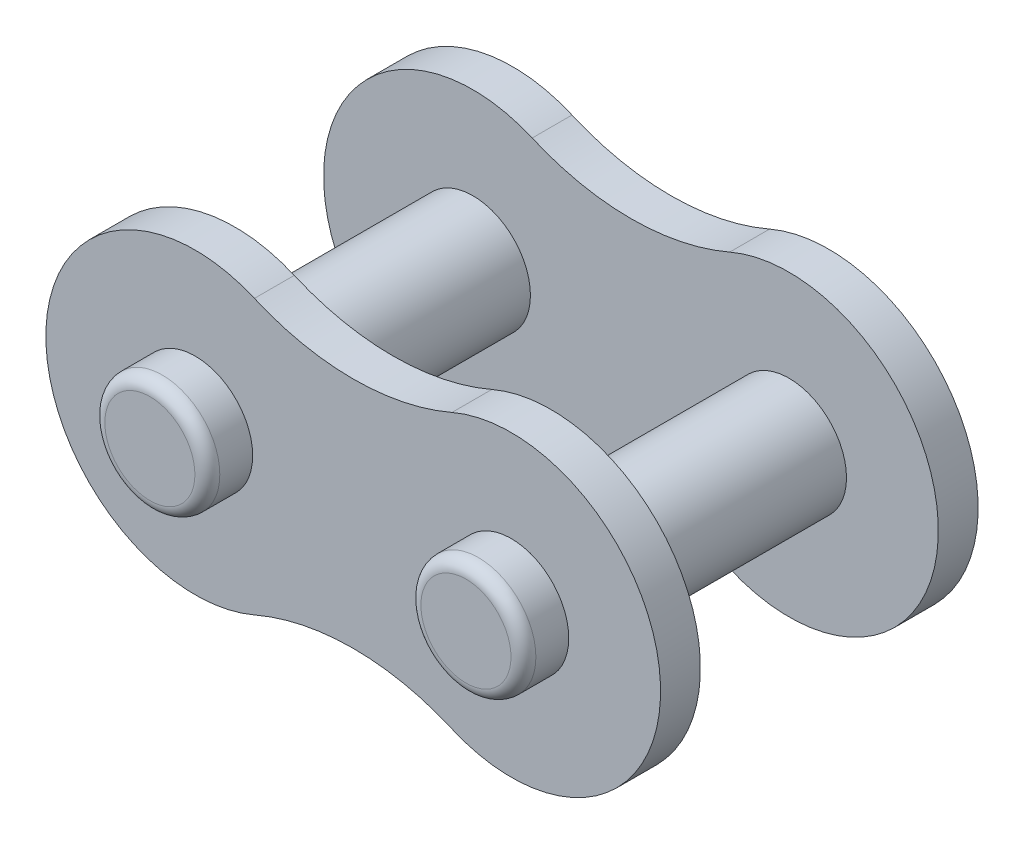
ISO-10303-21;
HEADER;
FILE_DESCRIPTION(('STEP AP214'),'2;1');
FILE_NAME('part.step','',(''),(''),'','','');
FILE_SCHEMA(('AUTOMOTIVE_DESIGN { 1 0 10303 214 1 1 1 1 }'));
ENDSEC;
DATA;
#1=APPLICATION_CONTEXT('core data for automotive mechanical design processes');
#2=APPLICATION_PROTOCOL_DEFINITION('international standard','automotive_design',2000,#1);
#3=PRODUCT_CONTEXT('',#1,'mechanical');
#4=PRODUCT('Part','Part','',(#3));
#5=PRODUCT_RELATED_PRODUCT_CATEGORY('part','',(#4));
#6=PRODUCT_DEFINITION_FORMATION('','',#4);
#7=PRODUCT_DEFINITION_CONTEXT('part definition',#1,'design');
#8=PRODUCT_DEFINITION('design','',#6,#7);
#9=PRODUCT_DEFINITION_SHAPE('','',#8);
#10=(LENGTH_UNIT() NAMED_UNIT(*) SI_UNIT(.MILLI.,.METRE.));
#11=(NAMED_UNIT(*) PLANE_ANGLE_UNIT() SI_UNIT($,.RADIAN.));
#12=(NAMED_UNIT(*) SI_UNIT($,.STERADIAN.) SOLID_ANGLE_UNIT());
#13=UNCERTAINTY_MEASURE_WITH_UNIT(LENGTH_MEASURE(1.E-05),#10,'distance_accuracy_value','');
#14=(GEOMETRIC_REPRESENTATION_CONTEXT(3) GLOBAL_UNCERTAINTY_ASSIGNED_CONTEXT((#13)) GLOBAL_UNIT_ASSIGNED_CONTEXT((#10,
#11,#12)) REPRESENTATION_CONTEXT('',''));
#15=CARTESIAN_POINT('',(0.,0.,0.));
#16=DIRECTION('',(0.,0.,1.));
#17=DIRECTION('',(1.,0.,0.));
#18=AXIS2_PLACEMENT_3D('',#15,#16,#17);
#19=CARTESIAN_POINT('',(3.175,7.34298134275173,0.8));
#20=DIRECTION('',(0.,0.,-1.));
#21=DIRECTION('',(-1.,0.,0.));
#22=AXIS2_PLACEMENT_3D('',#19,#20,#21);
#23=CYLINDRICAL_SURFACE('',#22,5.);
#24=CARTESIAN_POINT('',(3.175,7.34298134275173,0.));
#25=DIRECTION('',(0.,0.,-1.));
#26=DIRECTION('',(1.,0.,0.));
#27=AXIS2_PLACEMENT_3D('',#24,#25,#26);
#28=CIRCLE('',#27,5.);
#29=CARTESIAN_POINT('',(5.159375,2.7536180035319,0.));
#30=VERTEX_POINT('',#29);
#31=CARTESIAN_POINT('',(1.190625,2.7536180035319,0.));
#32=VERTEX_POINT('',#31);
#33=EDGE_CURVE('E151',#30,#32,#28,.T.);
#34=ORIENTED_EDGE('',*,*,#33,.T.);
#35=DIRECTION('',(0.,0.,-1.));
#36=VECTOR('',#35,1.);
#37=CARTESIAN_POINT('',(1.190625,2.7536180035319,0.8));
#38=LINE('',#37,#36);
#39=CARTESIAN_POINT('',(1.190625,2.7536180035319,0.8));
#40=VERTEX_POINT('',#39);
#41=EDGE_CURVE('E172',#40,#32,#38,.T.);
#42=ORIENTED_EDGE('',*,*,#41,.F.);
#43=CARTESIAN_POINT('',(3.175,7.34298134275173,0.8));
#44=DIRECTION('',(0.,0.,-1.));
#45=DIRECTION('',(1.,0.,0.));
#46=AXIS2_PLACEMENT_3D('',#43,#44,#45);
#47=CIRCLE('',#46,5.);
#48=CARTESIAN_POINT('',(5.159375,2.7536180035319,0.8));
#49=VERTEX_POINT('',#48);
#50=EDGE_CURVE('E154',#49,#40,#47,.T.);
#51=ORIENTED_EDGE('',*,*,#50,.F.);
#52=DIRECTION('',(0.,0.,-1.));
#53=VECTOR('',#52,1.);
#54=CARTESIAN_POINT('',(5.159375,2.7536180035319,0.8));
#55=LINE('',#54,#53);
#56=EDGE_CURVE('E160',#49,#30,#55,.T.);
#57=ORIENTED_EDGE('',*,*,#56,.T.);
#58=EDGE_LOOP('',(#34,#42,#51,#57));
#59=FACE_BOUND('',#58,.T.);
#60=ADVANCED_FACE('F35',(#59),#23,.F.);
#61=CARTESIAN_POINT('',(0.,0.,0.8));
#62=DIRECTION('',(0.,0.,-1.));
#63=DIRECTION('',(-1.,0.,0.));
#64=AXIS2_PLACEMENT_3D('',#61,#62,#63);
#65=CYLINDRICAL_SURFACE('',#64,3.);
#66=CARTESIAN_POINT('',(0.,0.,0.));
#67=DIRECTION('',(0.,0.,1.));
#68=DIRECTION('',(1.,0.,0.));
#69=AXIS2_PLACEMENT_3D('',#66,#67,#68);
#70=CIRCLE('',#69,3.);
#71=CARTESIAN_POINT('',(1.190625,-2.7536180035319,0.));
#72=VERTEX_POINT('',#71);
#73=EDGE_CURVE('E163',#32,#72,#70,.T.);
#74=ORIENTED_EDGE('',*,*,#73,.T.);
#75=DIRECTION('',(0.,0.,-1.));
#76=VECTOR('',#75,1.);
#77=CARTESIAN_POINT('',(1.190625,-2.7536180035319,0.8));
#78=LINE('',#77,#76);
#79=CARTESIAN_POINT('',(1.190625,-2.7536180035319,0.8));
#80=VERTEX_POINT('',#79);
#81=EDGE_CURVE('E170',#80,#72,#78,.T.);
#82=ORIENTED_EDGE('',*,*,#81,.F.);
#83=CARTESIAN_POINT('',(0.,0.,0.8));
#84=DIRECTION('',(0.,0.,1.));
#85=DIRECTION('',(1.,0.,0.));
#86=AXIS2_PLACEMENT_3D('',#83,#84,#85);
#87=CIRCLE('',#86,3.);
#88=EDGE_CURVE('E84',#40,#80,#87,.T.);
#89=ORIENTED_EDGE('',*,*,#88,.F.);
#90=ORIENTED_EDGE('',*,*,#41,.T.);
#91=EDGE_LOOP('',(#74,#82,#89,#90));
#92=FACE_BOUND('',#91,.T.);
#93=ADVANCED_FACE('F212',(#92),#65,.T.);
#94=CARTESIAN_POINT('',(3.175,-7.34298134275173,0.8));
#95=DIRECTION('',(0.,0.,-1.));
#96=DIRECTION('',(-1.,0.,0.));
#97=AXIS2_PLACEMENT_3D('',#94,#95,#96);
#98=CYLINDRICAL_SURFACE('',#97,5.);
#99=CARTESIAN_POINT('',(3.175,-7.34298134275173,0.));
#100=DIRECTION('',(0.,0.,-1.));
#101=DIRECTION('',(-1.,0.,0.));
#102=AXIS2_PLACEMENT_3D('',#99,#100,#101);
#103=CIRCLE('',#102,5.);
#104=CARTESIAN_POINT('',(5.159375,-2.7536180035319,0.));
#105=VERTEX_POINT('',#104);
#106=EDGE_CURVE('E70',#72,#105,#103,.T.);
#107=ORIENTED_EDGE('',*,*,#106,.T.);
#108=DIRECTION('',(0.,0.,-1.));
#109=VECTOR('',#108,1.);
#110=CARTESIAN_POINT('',(5.159375,-2.7536180035319,0.8));
#111=LINE('',#110,#109);
#112=CARTESIAN_POINT('',(5.159375,-2.7536180035319,0.8));
#113=VERTEX_POINT('',#112);
#114=EDGE_CURVE('E168',#113,#105,#111,.T.);
#115=ORIENTED_EDGE('',*,*,#114,.F.);
#116=CARTESIAN_POINT('',(3.175,-7.34298134275173,0.8));
#117=DIRECTION('',(0.,0.,-1.));
#118=DIRECTION('',(-1.,0.,0.));
#119=AXIS2_PLACEMENT_3D('',#116,#117,#118);
#120=CIRCLE('',#119,5.);
#121=EDGE_CURVE('E157',#80,#113,#120,.T.);
#122=ORIENTED_EDGE('',*,*,#121,.F.);
#123=ORIENTED_EDGE('',*,*,#81,.T.);
#124=EDGE_LOOP('',(#107,#115,#122,#123));
#125=FACE_BOUND('',#124,.T.);
#126=ADVANCED_FACE('F218',(#125),#98,.F.);
#127=CARTESIAN_POINT('',(6.35,0.,0.8));
#128=DIRECTION('',(0.,0.,-1.));
#129=DIRECTION('',(-1.,0.,0.));
#130=AXIS2_PLACEMENT_3D('',#127,#128,#129);
#131=CYLINDRICAL_SURFACE('',#130,3.);
#132=CARTESIAN_POINT('',(6.35,0.,0.));
#133=DIRECTION('',(0.,0.,1.));
#134=DIRECTION('',(1.,0.,0.));
#135=AXIS2_PLACEMENT_3D('',#132,#133,#134);
#136=CIRCLE('',#135,3.);
#137=EDGE_CURVE('E76',#105,#30,#136,.T.);
#138=ORIENTED_EDGE('',*,*,#137,.T.);
#139=ORIENTED_EDGE('',*,*,#56,.F.);
#140=CARTESIAN_POINT('',(6.35,0.,0.8));
#141=DIRECTION('',(0.,0.,1.));
#142=DIRECTION('',(1.,0.,0.));
#143=AXIS2_PLACEMENT_3D('',#140,#141,#142);
#144=CIRCLE('',#143,3.);
#145=EDGE_CURVE('E52',#113,#49,#144,.T.);
#146=ORIENTED_EDGE('',*,*,#145,.F.);
#147=ORIENTED_EDGE('',*,*,#114,.T.);
#148=EDGE_LOOP('',(#138,#139,#146,#147));
#149=FACE_BOUND('',#148,.T.);
#150=ADVANCED_FACE('F289',(#149),#131,.T.);
#151=CARTESIAN_POINT('',(4.7625,3.67149067137587,0.8));
#152=DIRECTION('',(0.,0.,1.));
#153=DIRECTION('',(1.,0.,0.));
#154=AXIS2_PLACEMENT_3D('',#151,#152,#153);
#155=PLANE('',#154);
#156=CARTESIAN_POINT('',(6.35,0.,0.8));
#157=DIRECTION('',(0.,0.,1.));
#158=DIRECTION('',(1.,0.,0.));
#159=AXIS2_PLACEMENT_3D('',#156,#157,#158);
#160=CIRCLE('',#159,1.155);
#161=CARTESIAN_POINT('',(7.505,0.,0.8));
#162=VERTEX_POINT('',#161);
#163=EDGE_CURVE('E136',#162,#162,#160,.T.);
#164=ORIENTED_EDGE('',*,*,#163,.F.);
#165=EDGE_LOOP('',(#164));
#166=FACE_BOUND('',#165,.T.);
#167=CARTESIAN_POINT('',(0.,0.,0.8));
#168=DIRECTION('',(0.,0.,1.));
#169=DIRECTION('',(1.,0.,0.));
#170=AXIS2_PLACEMENT_3D('',#167,#168,#169);
#171=CIRCLE('',#170,1.155);
#172=CARTESIAN_POINT('',(1.155,0.,0.8));
#173=VERTEX_POINT('',#172);
#174=EDGE_CURVE('E146',#173,#173,#171,.T.);
#175=ORIENTED_EDGE('',*,*,#174,.F.);
#176=EDGE_LOOP('',(#175));
#177=FACE_BOUND('',#176,.T.);
#178=ORIENTED_EDGE('',*,*,#50,.T.);
#179=ORIENTED_EDGE('',*,*,#88,.T.);
#180=ORIENTED_EDGE('',*,*,#121,.T.);
#181=ORIENTED_EDGE('',*,*,#145,.T.);
#182=EDGE_LOOP('',(#178,#179,#180,#181));
#183=FACE_BOUND('',#182,.T.);
#184=ADVANCED_FACE('F286',(#166,#177,#183),#155,.T.);
#185=CARTESIAN_POINT('',(4.7625,3.67149067137587,0.));
#186=DIRECTION('',(0.,0.,1.));
#187=DIRECTION('',(1.,0.,0.));
#188=AXIS2_PLACEMENT_3D('',#185,#186,#187);
#189=PLANE('',#188);
#190=CARTESIAN_POINT('',(6.35,0.,0.));
#191=DIRECTION('',(0.,0.,1.));
#192=DIRECTION('',(1.,0.,0.));
#193=AXIS2_PLACEMENT_3D('',#190,#191,#192);
#194=CIRCLE('',#193,1.155);
#195=CARTESIAN_POINT('',(7.505,0.,0.));
#196=VERTEX_POINT('',#195);
#197=EDGE_CURVE('E177',#196,#196,#194,.F.);
#198=ORIENTED_EDGE('',*,*,#197,.F.);
#199=EDGE_LOOP('',(#198));
#200=FACE_BOUND('',#199,.T.);
#201=CARTESIAN_POINT('',(0.,0.,0.));
#202=DIRECTION('',(0.,0.,1.));
#203=DIRECTION('',(1.,0.,0.));
#204=AXIS2_PLACEMENT_3D('',#201,#202,#203);
#205=CIRCLE('',#204,1.155);
#206=CARTESIAN_POINT('',(1.155,0.,0.));
#207=VERTEX_POINT('',#206);
#208=EDGE_CURVE('E174',#207,#207,#205,.F.);
#209=ORIENTED_EDGE('',*,*,#208,.F.);
#210=EDGE_LOOP('',(#209));
#211=FACE_BOUND('',#210,.T.);
#212=ORIENTED_EDGE('',*,*,#33,.F.);
#213=ORIENTED_EDGE('',*,*,#137,.F.);
#214=ORIENTED_EDGE('',*,*,#106,.F.);
#215=ORIENTED_EDGE('',*,*,#73,.F.);
#216=EDGE_LOOP('',(#212,#213,#214,#215));
#217=FACE_BOUND('',#216,.T.);
#218=ADVANCED_FACE('F284',(#200,#211,#217),#189,.F.);
#219=CARTESIAN_POINT('',(0.,0.,5.58));
#220=DIRECTION('',(0.,0.,-1.));
#221=DIRECTION('',(-1.,0.,0.));
#222=AXIS2_PLACEMENT_3D('',#219,#220,#221);
#223=CYLINDRICAL_SURFACE('',#222,1.155);
#224=CARTESIAN_POINT('',(0.,0.,5.58));
#225=DIRECTION('',(0.,0.,1.));
#226=DIRECTION('',(1.,0.,0.));
#227=AXIS2_PLACEMENT_3D('',#224,#225,#226);
#228=CIRCLE('',#227,1.155);
#229=CARTESIAN_POINT('',(1.155,0.,5.58));
#230=VERTEX_POINT('',#229);
#231=EDGE_CURVE('E148',#230,#230,#228,.T.);
#232=ORIENTED_EDGE('',*,*,#231,.F.);
#233=EDGE_LOOP('',(#232));
#234=FACE_BOUND('',#233,.T.);
#235=ORIENTED_EDGE('',*,*,#174,.T.);
#236=EDGE_LOOP('',(#235));
#237=FACE_BOUND('',#236,.T.);
#238=ADVANCED_FACE('F280',(#234,#237),#223,.T.);
#239=CARTESIAN_POINT('',(6.35,0.,5.58));
#240=DIRECTION('',(0.,0.,-1.));
#241=DIRECTION('',(-1.,0.,0.));
#242=AXIS2_PLACEMENT_3D('',#239,#240,#241);
#243=CYLINDRICAL_SURFACE('',#242,1.155);
#244=CARTESIAN_POINT('',(6.35,0.,5.58));
#245=DIRECTION('',(0.,0.,1.));
#246=DIRECTION('',(1.,0.,0.));
#247=AXIS2_PLACEMENT_3D('',#244,#245,#246);
#248=CIRCLE('',#247,1.155);
#249=CARTESIAN_POINT('',(7.505,0.,5.58));
#250=VERTEX_POINT('',#249);
#251=EDGE_CURVE('E139',#250,#250,#248,.T.);
#252=ORIENTED_EDGE('',*,*,#251,.F.);
#253=EDGE_LOOP('',(#252));
#254=FACE_BOUND('',#253,.T.);
#255=ORIENTED_EDGE('',*,*,#163,.T.);
#256=EDGE_LOOP('',(#255));
#257=FACE_BOUND('',#256,.T.);
#258=ADVANCED_FACE('F277',(#254,#257),#243,.T.);
#259=CARTESIAN_POINT('',(6.35,0.,6.38));
#260=DIRECTION('',(0.,0.,-1.));
#261=DIRECTION('',(-1.,0.,0.));
#262=AXIS2_PLACEMENT_3D('',#259,#260,#261);
#263=CYLINDRICAL_SURFACE('',#262,3.);
#264=CARTESIAN_POINT('',(6.35,0.,5.58));
#265=DIRECTION('',(0.,0.,1.));
#266=DIRECTION('',(1.,0.,0.));
#267=AXIS2_PLACEMENT_3D('',#264,#265,#266);
#268=CIRCLE('',#267,3.);
#269=CARTESIAN_POINT('',(5.159375,-2.7536180035319,5.58));
#270=VERTEX_POINT('',#269);
#271=CARTESIAN_POINT('',(5.159375,2.7536180035319,5.58));
#272=VERTEX_POINT('',#271);
#273=EDGE_CURVE('E135',#270,#272,#268,.T.);
#274=ORIENTED_EDGE('',*,*,#273,.T.);
#275=DIRECTION('',(0.,0.,-1.));
#276=VECTOR('',#275,1.);
#277=CARTESIAN_POINT('',(5.159375,2.7536180035319,6.38));
#278=LINE('',#277,#276);
#279=CARTESIAN_POINT('',(5.159375,2.7536180035319,6.38));
#280=VERTEX_POINT('',#279);
#281=EDGE_CURVE('E115',#280,#272,#278,.T.);
#282=ORIENTED_EDGE('',*,*,#281,.F.);
#283=CARTESIAN_POINT('',(6.35,0.,6.38));
#284=DIRECTION('',(0.,0.,1.));
#285=DIRECTION('',(1.,0.,0.));
#286=AXIS2_PLACEMENT_3D('',#283,#284,#285);
#287=CIRCLE('',#286,3.);
#288=CARTESIAN_POINT('',(5.159375,-2.7536180035319,6.38));
#289=VERTEX_POINT('',#288);
#290=EDGE_CURVE('E122',#289,#280,#287,.T.);
#291=ORIENTED_EDGE('',*,*,#290,.F.);
#292=DIRECTION('',(0.,0.,-1.));
#293=VECTOR('',#292,1.);
#294=CARTESIAN_POINT('',(5.159375,-2.7536180035319,6.38));
#295=LINE('',#294,#293);
#296=EDGE_CURVE('E489',#289,#270,#295,.T.);
#297=ORIENTED_EDGE('',*,*,#296,.T.);
#298=EDGE_LOOP('',(#274,#282,#291,#297));
#299=FACE_BOUND('',#298,.T.);
#300=ADVANCED_FACE('F133',(#299),#263,.T.);
#301=CARTESIAN_POINT('',(3.175,7.34298134275173,6.38));
#302=DIRECTION('',(0.,0.,-1.));
#303=DIRECTION('',(-1.,0.,0.));
#304=AXIS2_PLACEMENT_3D('',#301,#302,#303);
#305=CYLINDRICAL_SURFACE('',#304,5.);
#306=CARTESIAN_POINT('',(3.175,7.34298134275173,5.58));
#307=DIRECTION('',(0.,0.,-1.));
#308=DIRECTION('',(1.,0.,0.));
#309=AXIS2_PLACEMENT_3D('',#306,#307,#308);
#310=CIRCLE('',#309,5.);
#311=CARTESIAN_POINT('',(1.190625,2.7536180035319,5.58));
#312=VERTEX_POINT('',#311);
#313=EDGE_CURVE('E476',#272,#312,#310,.T.);
#314=ORIENTED_EDGE('',*,*,#313,.T.);
#315=DIRECTION('',(0.,0.,-1.));
#316=VECTOR('',#315,1.);
#317=CARTESIAN_POINT('',(1.190625,2.7536180035319,6.38));
#318=LINE('',#317,#316);
#319=CARTESIAN_POINT('',(1.190625,2.7536180035319,6.38));
#320=VERTEX_POINT('',#319);
#321=EDGE_CURVE('E118',#320,#312,#318,.T.);
#322=ORIENTED_EDGE('',*,*,#321,.F.);
#323=CARTESIAN_POINT('',(3.175,7.34298134275173,6.38));
#324=DIRECTION('',(0.,0.,-1.));
#325=DIRECTION('',(1.,0.,0.));
#326=AXIS2_PLACEMENT_3D('',#323,#324,#325);
#327=CIRCLE('',#326,5.);
#328=EDGE_CURVE('E111',#280,#320,#327,.T.);
#329=ORIENTED_EDGE('',*,*,#328,.F.);
#330=ORIENTED_EDGE('',*,*,#281,.T.);
#331=EDGE_LOOP('',(#314,#322,#329,#330));
#332=FACE_BOUND('',#331,.T.);
#333=ADVANCED_FACE('F113',(#332),#305,.F.);
#334=CARTESIAN_POINT('',(0.,0.,6.38));
#335=DIRECTION('',(0.,0.,-1.));
#336=DIRECTION('',(-1.,0.,0.));
#337=AXIS2_PLACEMENT_3D('',#334,#335,#336);
#338=CYLINDRICAL_SURFACE('',#337,3.);
#339=CARTESIAN_POINT('',(0.,0.,5.58));
#340=DIRECTION('',(0.,0.,1.));
#341=DIRECTION('',(1.,0.,0.));
#342=AXIS2_PLACEMENT_3D('',#339,#340,#341);
#343=CIRCLE('',#342,3.);
#344=CARTESIAN_POINT('',(1.190625,-2.7536180035319,5.58));
#345=VERTEX_POINT('',#344);
#346=EDGE_CURVE('E479',#312,#345,#343,.T.);
#347=ORIENTED_EDGE('',*,*,#346,.T.);
#348=DIRECTION('',(0.,0.,-1.));
#349=VECTOR('',#348,1.);
#350=CARTESIAN_POINT('',(1.190625,-2.7536180035319,6.38));
#351=LINE('',#350,#349);
#352=CARTESIAN_POINT('',(1.190625,-2.7536180035319,6.38));
#353=VERTEX_POINT('',#352);
#354=EDGE_CURVE('E141',#353,#345,#351,.T.);
#355=ORIENTED_EDGE('',*,*,#354,.F.);
#356=CARTESIAN_POINT('',(0.,0.,6.38));
#357=DIRECTION('',(0.,0.,1.));
#358=DIRECTION('',(1.,0.,0.));
#359=AXIS2_PLACEMENT_3D('',#356,#357,#358);
#360=CIRCLE('',#359,3.);
#361=EDGE_CURVE('E121',#320,#353,#360,.T.);
#362=ORIENTED_EDGE('',*,*,#361,.F.);
#363=ORIENTED_EDGE('',*,*,#321,.T.);
#364=EDGE_LOOP('',(#347,#355,#362,#363));
#365=FACE_BOUND('',#364,.T.);
#366=ADVANCED_FACE('F268',(#365),#338,.T.);
#367=CARTESIAN_POINT('',(3.175,-7.34298134275173,6.38));
#368=DIRECTION('',(0.,0.,-1.));
#369=DIRECTION('',(-1.,0.,0.));
#370=AXIS2_PLACEMENT_3D('',#367,#368,#369);
#371=CYLINDRICAL_SURFACE('',#370,5.);
#372=CARTESIAN_POINT('',(3.175,-7.34298134275173,5.58));
#373=DIRECTION('',(0.,0.,-1.));
#374=DIRECTION('',(1.,0.,0.));
#375=AXIS2_PLACEMENT_3D('',#372,#373,#374);
#376=CIRCLE('',#375,5.);
#377=EDGE_CURVE('E131',#345,#270,#376,.T.);
#378=ORIENTED_EDGE('',*,*,#377,.T.);
#379=ORIENTED_EDGE('',*,*,#296,.F.);
#380=CARTESIAN_POINT('',(3.175,-7.34298134275173,6.38));
#381=DIRECTION('',(0.,0.,-1.));
#382=DIRECTION('',(1.,0.,0.));
#383=AXIS2_PLACEMENT_3D('',#380,#381,#382);
#384=CIRCLE('',#383,5.);
#385=EDGE_CURVE('E127',#353,#289,#384,.T.);
#386=ORIENTED_EDGE('',*,*,#385,.F.);
#387=ORIENTED_EDGE('',*,*,#354,.T.);
#388=EDGE_LOOP('',(#378,#379,#386,#387));
#389=FACE_BOUND('',#388,.T.);
#390=ADVANCED_FACE('F261',(#389),#371,.F.);
#391=CARTESIAN_POINT('',(4.7625,3.67149067137587,6.38));
#392=DIRECTION('',(0.,0.,1.));
#393=DIRECTION('',(1.,0.,0.));
#394=AXIS2_PLACEMENT_3D('',#391,#392,#393);
#395=PLANE('',#394);
#396=CARTESIAN_POINT('',(6.35,0.,6.38));
#397=DIRECTION('',(0.,0.,1.));
#398=DIRECTION('',(1.,0.,0.));
#399=AXIS2_PLACEMENT_3D('',#396,#397,#398);
#400=CIRCLE('',#399,1.155);
#401=CARTESIAN_POINT('',(7.505,0.,6.38));
#402=VERTEX_POINT('',#401);
#403=EDGE_CURVE('E482',#402,#402,#400,.T.);
#404=ORIENTED_EDGE('',*,*,#403,.F.);
#405=EDGE_LOOP('',(#404));
#406=FACE_BOUND('',#405,.T.);
#407=CARTESIAN_POINT('',(0.,0.,6.38));
#408=DIRECTION('',(0.,0.,1.));
#409=DIRECTION('',(1.,0.,0.));
#410=AXIS2_PLACEMENT_3D('',#407,#408,#409);
#411=CIRCLE('',#410,1.155);
#412=CARTESIAN_POINT('',(1.155,0.,6.38));
#413=VERTEX_POINT('',#412);
#414=EDGE_CURVE('E477',#413,#413,#411,.T.);
#415=ORIENTED_EDGE('',*,*,#414,.F.);
#416=EDGE_LOOP('',(#415));
#417=FACE_BOUND('',#416,.T.);
#418=ORIENTED_EDGE('',*,*,#290,.T.);
#419=ORIENTED_EDGE('',*,*,#328,.T.);
#420=ORIENTED_EDGE('',*,*,#361,.T.);
#421=ORIENTED_EDGE('',*,*,#385,.T.);
#422=EDGE_LOOP('',(#418,#419,#420,#421));
#423=FACE_BOUND('',#422,.T.);
#424=ADVANCED_FACE('F125',(#406,#417,#423),#395,.T.);
#425=CARTESIAN_POINT('',(4.7625,3.67149067137587,5.58));
#426=DIRECTION('',(0.,0.,1.));
#427=DIRECTION('',(1.,0.,0.));
#428=AXIS2_PLACEMENT_3D('',#425,#426,#427);
#429=PLANE('',#428);
#430=ORIENTED_EDGE('',*,*,#231,.T.);
#431=EDGE_LOOP('',(#430));
#432=FACE_BOUND('',#431,.T.);
#433=ORIENTED_EDGE('',*,*,#251,.T.);
#434=EDGE_LOOP('',(#433));
#435=FACE_BOUND('',#434,.T.);
#436=ORIENTED_EDGE('',*,*,#273,.F.);
#437=ORIENTED_EDGE('',*,*,#377,.F.);
#438=ORIENTED_EDGE('',*,*,#346,.F.);
#439=ORIENTED_EDGE('',*,*,#313,.F.);
#440=EDGE_LOOP('',(#436,#437,#438,#439));
#441=FACE_BOUND('',#440,.T.);
#442=ADVANCED_FACE('F257',(#432,#435,#441),#429,.F.);
#443=CARTESIAN_POINT('',(0.,0.,7.29));
#444=DIRECTION('',(0.,0.,-1.));
#445=DIRECTION('',(-1.,0.,0.));
#446=AXIS2_PLACEMENT_3D('',#443,#444,#445);
#447=CYLINDRICAL_SURFACE('',#446,1.155);
#448=CARTESIAN_POINT('',(0.,0.,7.04));
#449=DIRECTION('',(0.,0.,1.));
#450=DIRECTION('',(1.,0.,0.));
#451=AXIS2_PLACEMENT_3D('',#448,#449,#450);
#452=CIRCLE('',#451,1.155);
#453=CARTESIAN_POINT('',(1.155,0.,7.04));
#454=VERTEX_POINT('',#453);
#455=EDGE_CURVE('E183',#454,#454,#452,.F.);
#456=ORIENTED_EDGE('',*,*,#455,.T.);
#457=EDGE_LOOP('',(#456));
#458=FACE_BOUND('',#457,.T.);
#459=ORIENTED_EDGE('',*,*,#414,.T.);
#460=EDGE_LOOP('',(#459));
#461=FACE_BOUND('',#460,.T.);
#462=ADVANCED_FACE('F253',(#458,#461),#447,.T.);
#463=CARTESIAN_POINT('',(0.,0.,7.29));
#464=DIRECTION('',(0.,0.,1.));
#465=DIRECTION('',(1.,0.,0.));
#466=AXIS2_PLACEMENT_3D('',#463,#464,#465);
#467=PLANE('',#466);
#468=CARTESIAN_POINT('',(0.,0.,7.29));
#469=DIRECTION('',(0.,0.,1.));
#470=DIRECTION('',(1.,0.,0.));
#471=AXIS2_PLACEMENT_3D('',#468,#469,#470);
#472=CIRCLE('',#471,0.905);
#473=CARTESIAN_POINT('',(0.905,0.,7.29));
#474=VERTEX_POINT('',#473);
#475=EDGE_CURVE('E180',#474,#474,#472,.T.);
#476=ORIENTED_EDGE('',*,*,#475,.T.);
#477=EDGE_LOOP('',(#476));
#478=FACE_BOUND('',#477,.T.);
#479=ADVANCED_FACE('F246',(#478),#467,.T.);
#480=CARTESIAN_POINT('',(6.35,0.,7.29));
#481=DIRECTION('',(0.,0.,-1.));
#482=DIRECTION('',(-1.,0.,0.));
#483=AXIS2_PLACEMENT_3D('',#480,#481,#482);
#484=CYLINDRICAL_SURFACE('',#483,1.155);
#485=CARTESIAN_POINT('',(6.35,0.,7.04));
#486=DIRECTION('',(0.,0.,1.));
#487=DIRECTION('',(1.,0.,0.));
#488=AXIS2_PLACEMENT_3D('',#485,#486,#487);
#489=CIRCLE('',#488,1.155);
#490=CARTESIAN_POINT('',(7.505,0.,7.04));
#491=VERTEX_POINT('',#490);
#492=EDGE_CURVE('E189',#491,#491,#489,.F.);
#493=ORIENTED_EDGE('',*,*,#492,.T.);
#494=EDGE_LOOP('',(#493));
#495=FACE_BOUND('',#494,.T.);
#496=ORIENTED_EDGE('',*,*,#403,.T.);
#497=EDGE_LOOP('',(#496));
#498=FACE_BOUND('',#497,.T.);
#499=ADVANCED_FACE('F238',(#495,#498),#484,.T.);
#500=CARTESIAN_POINT('',(6.35,0.,7.29));
#501=DIRECTION('',(0.,0.,1.));
#502=DIRECTION('',(1.,0.,0.));
#503=AXIS2_PLACEMENT_3D('',#500,#501,#502);
#504=PLANE('',#503);
#505=CARTESIAN_POINT('',(6.35,0.,7.29));
#506=DIRECTION('',(0.,0.,1.));
#507=DIRECTION('',(1.,0.,0.));
#508=AXIS2_PLACEMENT_3D('',#505,#506,#507);
#509=CIRCLE('',#508,0.905);
#510=CARTESIAN_POINT('',(7.255,0.,7.29));
#511=VERTEX_POINT('',#510);
#512=EDGE_CURVE('E186',#511,#511,#509,.T.);
#513=ORIENTED_EDGE('',*,*,#512,.T.);
#514=EDGE_LOOP('',(#513));
#515=FACE_BOUND('',#514,.T.);
#516=ADVANCED_FACE('F235',(#515),#504,.T.);
#517=CARTESIAN_POINT('',(0.,0.,-0.91));
#518=DIRECTION('',(0.,0.,1.));
#519=DIRECTION('',(1.,0.,0.));
#520=AXIS2_PLACEMENT_3D('',#517,#518,#519);
#521=CYLINDRICAL_SURFACE('',#520,1.155);
#522=CARTESIAN_POINT('',(0.,0.,-0.66));
#523=DIRECTION('',(0.,0.,-1.));
#524=DIRECTION('',(-1.,0.,0.));
#525=AXIS2_PLACEMENT_3D('',#522,#523,#524);
#526=CIRCLE('',#525,1.155);
#527=CARTESIAN_POINT('',(-1.155,0.,-0.66));
#528=VERTEX_POINT('',#527);
#529=EDGE_CURVE('E11',#528,#528,#526,.F.);
#530=ORIENTED_EDGE('',*,*,#529,.T.);
#531=EDGE_LOOP('',(#530));
#532=FACE_BOUND('',#531,.T.);
#533=ORIENTED_EDGE('',*,*,#208,.T.);
#534=EDGE_LOOP('',(#533));
#535=FACE_BOUND('',#534,.T.);
#536=ADVANCED_FACE('F237',(#532,#535),#521,.T.);
#537=CARTESIAN_POINT('',(0.,0.,-0.91));
#538=DIRECTION('',(0.,0.,-1.));
#539=DIRECTION('',(-1.,0.,0.));
#540=AXIS2_PLACEMENT_3D('',#537,#538,#539);
#541=PLANE('',#540);
#542=CARTESIAN_POINT('',(0.,0.,-0.91));
#543=DIRECTION('',(0.,0.,-1.));
#544=DIRECTION('',(-1.,0.,0.));
#545=AXIS2_PLACEMENT_3D('',#542,#543,#544);
#546=CIRCLE('',#545,0.905);
#547=CARTESIAN_POINT('',(-0.905,0.,-0.91));
#548=VERTEX_POINT('',#547);
#549=EDGE_CURVE('E44',#548,#548,#546,.T.);
#550=ORIENTED_EDGE('',*,*,#549,.T.);
#551=EDGE_LOOP('',(#550));
#552=FACE_BOUND('',#551,.T.);
#553=ADVANCED_FACE('F200',(#552),#541,.T.);
#554=CARTESIAN_POINT('',(6.35,0.,-0.91));
#555=DIRECTION('',(0.,0.,1.));
#556=DIRECTION('',(1.,0.,0.));
#557=AXIS2_PLACEMENT_3D('',#554,#555,#556);
#558=CYLINDRICAL_SURFACE('',#557,1.155);
#559=CARTESIAN_POINT('',(6.35,0.,-0.66));
#560=DIRECTION('',(0.,0.,-1.));
#561=DIRECTION('',(-1.,0.,0.));
#562=AXIS2_PLACEMENT_3D('',#559,#560,#561);
#563=CIRCLE('',#562,1.155);
#564=CARTESIAN_POINT('',(5.195,0.,-0.66));
#565=VERTEX_POINT('',#564);
#566=EDGE_CURVE('E195',#565,#565,#563,.F.);
#567=ORIENTED_EDGE('',*,*,#566,.T.);
#568=EDGE_LOOP('',(#567));
#569=FACE_BOUND('',#568,.T.);
#570=ORIENTED_EDGE('',*,*,#197,.T.);
#571=EDGE_LOOP('',(#570));
#572=FACE_BOUND('',#571,.T.);
#573=ADVANCED_FACE('F375',(#569,#572),#558,.T.);
#574=CARTESIAN_POINT('',(6.35,0.,-0.91));
#575=DIRECTION('',(0.,0.,-1.));
#576=DIRECTION('',(-1.,0.,0.));
#577=AXIS2_PLACEMENT_3D('',#574,#575,#576);
#578=PLANE('',#577);
#579=CARTESIAN_POINT('',(6.35,0.,-0.91));
#580=DIRECTION('',(0.,0.,-1.));
#581=DIRECTION('',(-1.,0.,0.));
#582=AXIS2_PLACEMENT_3D('',#579,#580,#581);
#583=CIRCLE('',#582,0.905);
#584=CARTESIAN_POINT('',(5.445,0.,-0.91));
#585=VERTEX_POINT('',#584);
#586=EDGE_CURVE('E192',#585,#585,#583,.T.);
#587=ORIENTED_EDGE('',*,*,#586,.T.);
#588=EDGE_LOOP('',(#587));
#589=FACE_BOUND('',#588,.T.);
#590=ADVANCED_FACE('F225',(#589),#578,.T.);
#591=CARTESIAN_POINT('',(0.,0.,7.04));
#592=DIRECTION('',(0.,0.,1.));
#593=DIRECTION('',(1.,0.,0.));
#594=AXIS2_PLACEMENT_3D('',#591,#592,#593);
#595=TOROIDAL_SURFACE('',#594,0.905,0.25);
#596=ORIENTED_EDGE('',*,*,#455,.F.);
#597=EDGE_LOOP('',(#596));
#598=FACE_BOUND('',#597,.T.);
#599=ORIENTED_EDGE('',*,*,#475,.F.);
#600=EDGE_LOOP('',(#599));
#601=FACE_BOUND('',#600,.T.);
#602=ADVANCED_FACE('F222',(#598,#601),#595,.T.);
#603=CARTESIAN_POINT('',(6.35,0.,7.04));
#604=DIRECTION('',(0.,0.,1.));
#605=DIRECTION('',(1.,0.,0.));
#606=AXIS2_PLACEMENT_3D('',#603,#604,#605);
#607=TOROIDAL_SURFACE('',#606,0.905,0.25);
#608=ORIENTED_EDGE('',*,*,#492,.F.);
#609=EDGE_LOOP('',(#608));
#610=FACE_BOUND('',#609,.T.);
#611=ORIENTED_EDGE('',*,*,#512,.F.);
#612=EDGE_LOOP('',(#611));
#613=FACE_BOUND('',#612,.T.);
#614=ADVANCED_FACE('F208',(#610,#613),#607,.T.);
#615=CARTESIAN_POINT('',(6.35,0.,-0.66));
#616=DIRECTION('',(0.,0.,-1.));
#617=DIRECTION('',(-1.,0.,0.));
#618=AXIS2_PLACEMENT_3D('',#615,#616,#617);
#619=TOROIDAL_SURFACE('',#618,0.905,0.25);
#620=ORIENTED_EDGE('',*,*,#566,.F.);
#621=EDGE_LOOP('',(#620));
#622=FACE_BOUND('',#621,.T.);
#623=ORIENTED_EDGE('',*,*,#586,.F.);
#624=EDGE_LOOP('',(#623));
#625=FACE_BOUND('',#624,.T.);
#626=ADVANCED_FACE('F203',(#622,#625),#619,.T.);
#627=CARTESIAN_POINT('',(0.,0.,-0.66));
#628=DIRECTION('',(0.,0.,-1.));
#629=DIRECTION('',(-1.,0.,0.));
#630=AXIS2_PLACEMENT_3D('',#627,#628,#629);
#631=TOROIDAL_SURFACE('',#630,0.905,0.25);
#632=ORIENTED_EDGE('',*,*,#529,.F.);
#633=EDGE_LOOP('',(#632));
#634=FACE_BOUND('',#633,.T.);
#635=ORIENTED_EDGE('',*,*,#549,.F.);
#636=EDGE_LOOP('',(#635));
#637=FACE_BOUND('',#636,.T.);
#638=ADVANCED_FACE('F37',(#634,#637),#631,.T.);
#639=CLOSED_SHELL('',(#60,#93,#126,#150,#184,#218,#238,#258,#300,#333,#366,#390,#424,#442,#462,
#479,#499,#516,#536,#553,#573,#590,#602,#614,#626,#638));
#640=MANIFOLD_SOLID_BREP('B2',#639);
#641=ADVANCED_BREP_SHAPE_REPRESENTATION('',(#18,#640),#14);
#642=SHAPE_DEFINITION_REPRESENTATION(#9,#641);
ENDSEC;
END-ISO-10303-21;
